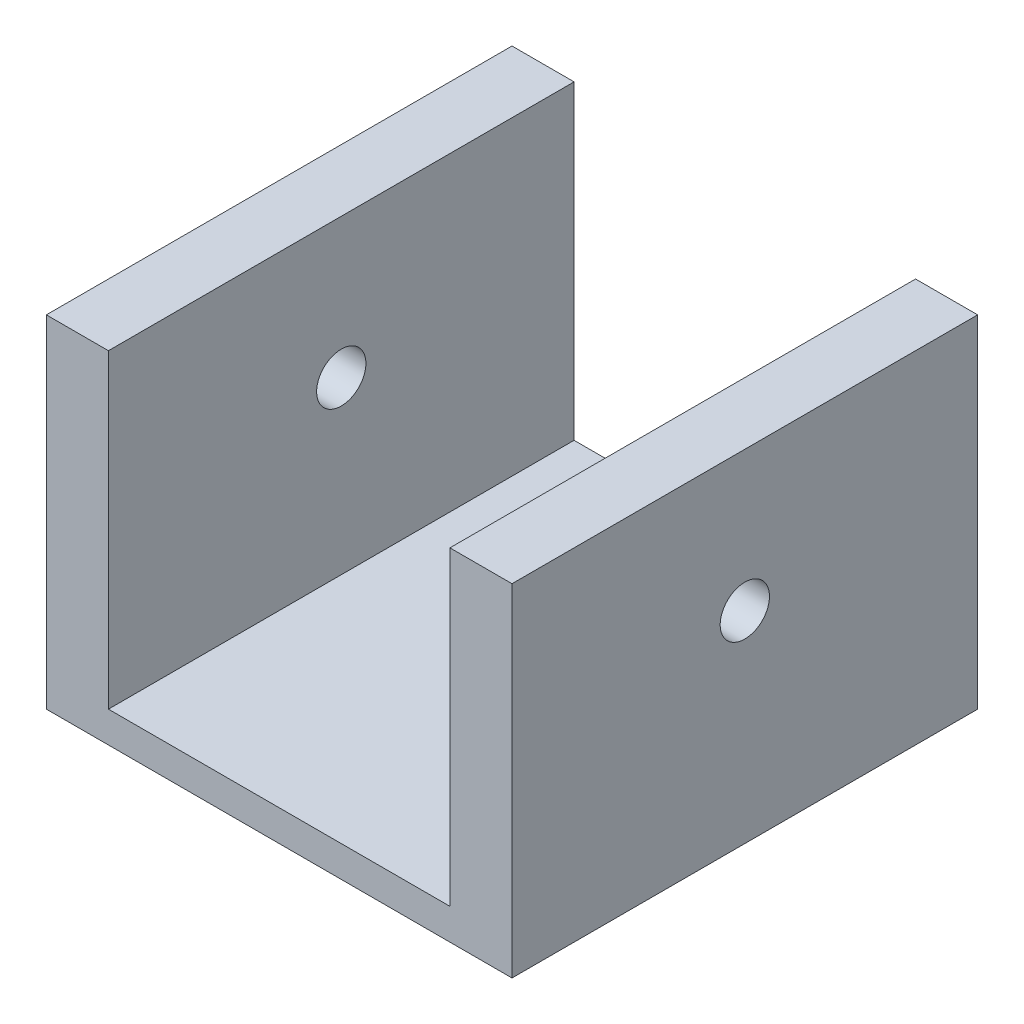
ISO-10303-21;
HEADER;
FILE_DESCRIPTION(('STEP AP214'),'2;1');
FILE_NAME('part.step','',(''),(''),'','','');
FILE_SCHEMA(('AUTOMOTIVE_DESIGN { 1 0 10303 214 1 1 1 1 }'));
ENDSEC;
DATA;
#1=APPLICATION_CONTEXT('core data for automotive mechanical design processes');
#2=APPLICATION_PROTOCOL_DEFINITION('international standard','automotive_design',2000,#1);
#3=PRODUCT_CONTEXT('',#1,'mechanical');
#4=PRODUCT('Part','Part','',(#3));
#5=PRODUCT_RELATED_PRODUCT_CATEGORY('part','',(#4));
#6=PRODUCT_DEFINITION_FORMATION('','',#4);
#7=PRODUCT_DEFINITION_CONTEXT('part definition',#1,'design');
#8=PRODUCT_DEFINITION('design','',#6,#7);
#9=PRODUCT_DEFINITION_SHAPE('','',#8);
#10=(LENGTH_UNIT() NAMED_UNIT(*) SI_UNIT(.MILLI.,.METRE.));
#11=(NAMED_UNIT(*) PLANE_ANGLE_UNIT() SI_UNIT($,.RADIAN.));
#12=(NAMED_UNIT(*) SI_UNIT($,.STERADIAN.) SOLID_ANGLE_UNIT());
#13=UNCERTAINTY_MEASURE_WITH_UNIT(LENGTH_MEASURE(1.E-05),#10,'distance_accuracy_value','');
#14=(GEOMETRIC_REPRESENTATION_CONTEXT(3) GLOBAL_UNCERTAINTY_ASSIGNED_CONTEXT((#13)) GLOBAL_UNIT_ASSIGNED_CONTEXT((#10,
#11,#12)) REPRESENTATION_CONTEXT('',''));
#15=CARTESIAN_POINT('',(0.,0.,0.));
#16=DIRECTION('',(0.,0.,1.));
#17=DIRECTION('',(1.,0.,0.));
#18=AXIS2_PLACEMENT_3D('',#15,#16,#17);
#19=CARTESIAN_POINT('',(0.,10.,0.));
#20=DIRECTION('',(0.,-1.,0.));
#21=DIRECTION('',(0.,0.,-1.));
#22=AXIS2_PLACEMENT_3D('',#19,#20,#21);
#23=PLANE('',#22);
#24=DIRECTION('',(0.,0.,1.));
#25=VECTOR('',#24,1.);
#26=CARTESIAN_POINT('',(55.,10.,75.));
#27=LINE('',#26,#25);
#28=CARTESIAN_POINT('',(55.,10.,-75.));
#29=VERTEX_POINT('',#28);
#30=CARTESIAN_POINT('',(55.,10.,75.));
#31=VERTEX_POINT('',#30);
#32=EDGE_CURVE('E55',#29,#31,#27,.T.);
#33=ORIENTED_EDGE('',*,*,#32,.F.);
#34=DIRECTION('',(-1.,0.,0.));
#35=VECTOR('',#34,1.);
#36=CARTESIAN_POINT('',(-75.,10.,-75.));
#37=LINE('',#36,#35);
#38=CARTESIAN_POINT('',(-55.,10.,-75.));
#39=VERTEX_POINT('',#38);
#40=EDGE_CURVE('E153',#29,#39,#37,.T.);
#41=ORIENTED_EDGE('',*,*,#40,.T.);
#42=DIRECTION('',(0.,0.,-1.));
#43=VECTOR('',#42,1.);
#44=CARTESIAN_POINT('',(-55.,10.,75.));
#45=LINE('',#44,#43);
#46=CARTESIAN_POINT('',(-55.,10.,75.));
#47=VERTEX_POINT('',#46);
#48=EDGE_CURVE('E129',#47,#39,#45,.T.);
#49=ORIENTED_EDGE('',*,*,#48,.F.);
#50=DIRECTION('',(1.,0.,0.));
#51=VECTOR('',#50,1.);
#52=CARTESIAN_POINT('',(-75.,10.,75.));
#53=LINE('',#52,#51);
#54=EDGE_CURVE('E60',#47,#31,#53,.T.);
#55=ORIENTED_EDGE('',*,*,#54,.T.);
#56=EDGE_LOOP('',(#33,#41,#49,#55));
#57=FACE_BOUND('',#56,.T.);
#58=ADVANCED_FACE('F39',(#57),#23,.F.);
#59=CARTESIAN_POINT('',(75.,10.,75.));
#60=DIRECTION('',(-1.,0.,0.));
#61=DIRECTION('',(0.,0.,1.));
#62=AXIS2_PLACEMENT_3D('',#59,#60,#61);
#63=PLANE('',#62);
#64=CARTESIAN_POINT('',(75.,65.,0.));
#65=DIRECTION('',(1.,0.,0.));
#66=DIRECTION('',(0.,0.,-1.));
#67=AXIS2_PLACEMENT_3D('',#64,#65,#66);
#68=CIRCLE('',#67,7.9375);
#69=CARTESIAN_POINT('',(75.,65.,-7.9375));
#70=VERTEX_POINT('',#69);
#71=EDGE_CURVE('E184',#70,#70,#68,.T.);
#72=ORIENTED_EDGE('',*,*,#71,.F.);
#73=EDGE_LOOP('',(#72));
#74=FACE_BOUND('',#73,.T.);
#75=DIRECTION('',(0.,0.,-1.));
#76=VECTOR('',#75,1.);
#77=CARTESIAN_POINT('',(75.,0.,75.));
#78=LINE('',#77,#76);
#79=CARTESIAN_POINT('',(75.,0.,75.));
#80=VERTEX_POINT('',#79);
#81=CARTESIAN_POINT('',(75.,0.,-75.));
#82=VERTEX_POINT('',#81);
#83=EDGE_CURVE('E152',#80,#82,#78,.T.);
#84=ORIENTED_EDGE('',*,*,#83,.T.);
#85=DIRECTION('',(0.,-1.,0.));
#86=VECTOR('',#85,1.);
#87=CARTESIAN_POINT('',(75.,10.,-75.));
#88=LINE('',#87,#86);
#89=CARTESIAN_POINT('',(75.,110.,-75.));
#90=VERTEX_POINT('',#89);
#91=EDGE_CURVE('E11',#90,#82,#88,.T.);
#92=ORIENTED_EDGE('',*,*,#91,.F.);
#93=DIRECTION('',(0.,0.,-1.));
#94=VECTOR('',#93,1.);
#95=CARTESIAN_POINT('',(75.,110.,75.));
#96=LINE('',#95,#94);
#97=CARTESIAN_POINT('',(75.,110.,75.));
#98=VERTEX_POINT('',#97);
#99=EDGE_CURVE('E120',#98,#90,#96,.T.);
#100=ORIENTED_EDGE('',*,*,#99,.F.);
#101=DIRECTION('',(0.,-1.,0.));
#102=VECTOR('',#101,1.);
#103=CARTESIAN_POINT('',(75.,10.,75.));
#104=LINE('',#103,#102);
#105=EDGE_CURVE('E103',#98,#80,#104,.T.);
#106=ORIENTED_EDGE('',*,*,#105,.T.);
#107=EDGE_LOOP('',(#84,#92,#100,#106));
#108=FACE_BOUND('',#107,.T.);
#109=ADVANCED_FACE('F41',(#74,#108),#63,.F.);
#110=CARTESIAN_POINT('',(-75.,10.,-75.));
#111=DIRECTION('',(0.,0.,1.));
#112=DIRECTION('',(1.,0.,0.));
#113=AXIS2_PLACEMENT_3D('',#110,#111,#112);
#114=PLANE('',#113);
#115=DIRECTION('',(-1.,0.,0.));
#116=VECTOR('',#115,1.);
#117=CARTESIAN_POINT('',(-75.,0.,-75.));
#118=LINE('',#117,#116);
#119=CARTESIAN_POINT('',(-75.,0.,-75.));
#120=VERTEX_POINT('',#119);
#121=EDGE_CURVE('E157',#82,#120,#118,.T.);
#122=ORIENTED_EDGE('',*,*,#121,.T.);
#123=DIRECTION('',(0.,-1.,0.));
#124=VECTOR('',#123,1.);
#125=CARTESIAN_POINT('',(-75.,10.,-75.));
#126=LINE('',#125,#124);
#127=CARTESIAN_POINT('',(-75.,110.,-75.));
#128=VERTEX_POINT('',#127);
#129=EDGE_CURVE('E48',#128,#120,#126,.T.);
#130=ORIENTED_EDGE('',*,*,#129,.F.);
#131=DIRECTION('',(-1.,0.,0.));
#132=VECTOR('',#131,1.);
#133=CARTESIAN_POINT('',(-75.,110.,-75.));
#134=LINE('',#133,#132);
#135=CARTESIAN_POINT('',(-55.,110.,-75.));
#136=VERTEX_POINT('',#135);
#137=EDGE_CURVE('E141',#136,#128,#134,.T.);
#138=ORIENTED_EDGE('',*,*,#137,.F.);
#139=DIRECTION('',(0.,-1.,0.));
#140=VECTOR('',#139,1.);
#141=CARTESIAN_POINT('',(-55.,110.,-75.));
#142=LINE('',#141,#140);
#143=EDGE_CURVE('E144',#136,#39,#142,.T.);
#144=ORIENTED_EDGE('',*,*,#143,.T.);
#145=ORIENTED_EDGE('',*,*,#40,.F.);
#146=DIRECTION('',(0.,-1.,0.));
#147=VECTOR('',#146,1.);
#148=CARTESIAN_POINT('',(55.,110.,-75.));
#149=LINE('',#148,#147);
#150=CARTESIAN_POINT('',(55.,110.,-75.));
#151=VERTEX_POINT('',#150);
#152=EDGE_CURVE('E175',#151,#29,#149,.T.);
#153=ORIENTED_EDGE('',*,*,#152,.F.);
#154=DIRECTION('',(-1.,0.,0.));
#155=VECTOR('',#154,1.);
#156=CARTESIAN_POINT('',(75.,110.,-75.));
#157=LINE('',#156,#155);
#158=EDGE_CURVE('E127',#90,#151,#157,.T.);
#159=ORIENTED_EDGE('',*,*,#158,.F.);
#160=ORIENTED_EDGE('',*,*,#91,.T.);
#161=EDGE_LOOP('',(#122,#130,#138,#144,#145,#153,#159,#160));
#162=FACE_BOUND('',#161,.T.);
#163=ADVANCED_FACE('F172',(#162),#114,.F.);
#164=CARTESIAN_POINT('',(-75.,10.,75.));
#165=DIRECTION('',(1.,0.,0.));
#166=DIRECTION('',(0.,0.,-1.));
#167=AXIS2_PLACEMENT_3D('',#164,#165,#166);
#168=PLANE('',#167);
#169=CARTESIAN_POINT('',(-75.,65.,0.));
#170=DIRECTION('',(1.,0.,0.));
#171=DIRECTION('',(0.,0.,-1.));
#172=AXIS2_PLACEMENT_3D('',#169,#170,#171);
#173=CIRCLE('',#172,7.9375);
#174=CARTESIAN_POINT('',(-75.,65.,-7.9375));
#175=VERTEX_POINT('',#174);
#176=EDGE_CURVE('E187',#175,#175,#173,.T.);
#177=ORIENTED_EDGE('',*,*,#176,.T.);
#178=EDGE_LOOP('',(#177));
#179=FACE_BOUND('',#178,.T.);
#180=DIRECTION('',(0.,0.,1.));
#181=VECTOR('',#180,1.);
#182=CARTESIAN_POINT('',(-75.,0.,75.));
#183=LINE('',#182,#181);
#184=CARTESIAN_POINT('',(-75.,0.,75.));
#185=VERTEX_POINT('',#184);
#186=EDGE_CURVE('E159',#120,#185,#183,.T.);
#187=ORIENTED_EDGE('',*,*,#186,.T.);
#188=DIRECTION('',(0.,-1.,0.));
#189=VECTOR('',#188,1.);
#190=CARTESIAN_POINT('',(-75.,10.,75.));
#191=LINE('',#190,#189);
#192=CARTESIAN_POINT('',(-75.,110.,75.));
#193=VERTEX_POINT('',#192);
#194=EDGE_CURVE('E115',#193,#185,#191,.T.);
#195=ORIENTED_EDGE('',*,*,#194,.F.);
#196=DIRECTION('',(0.,0.,1.));
#197=VECTOR('',#196,1.);
#198=CARTESIAN_POINT('',(-75.,110.,75.));
#199=LINE('',#198,#197);
#200=EDGE_CURVE('E134',#128,#193,#199,.T.);
#201=ORIENTED_EDGE('',*,*,#200,.F.);
#202=ORIENTED_EDGE('',*,*,#129,.T.);
#203=EDGE_LOOP('',(#187,#195,#201,#202));
#204=FACE_BOUND('',#203,.T.);
#205=ADVANCED_FACE('F167',(#179,#204),#168,.F.);
#206=CARTESIAN_POINT('',(-75.,10.,75.));
#207=DIRECTION('',(0.,0.,-1.));
#208=DIRECTION('',(-1.,0.,0.));
#209=AXIS2_PLACEMENT_3D('',#206,#207,#208);
#210=PLANE('',#209);
#211=DIRECTION('',(1.,0.,0.));
#212=VECTOR('',#211,1.);
#213=CARTESIAN_POINT('',(-75.,0.,75.));
#214=LINE('',#213,#212);
#215=EDGE_CURVE('E110',#185,#80,#214,.T.);
#216=ORIENTED_EDGE('',*,*,#215,.T.);
#217=ORIENTED_EDGE('',*,*,#105,.F.);
#218=DIRECTION('',(1.,0.,0.));
#219=VECTOR('',#218,1.);
#220=CARTESIAN_POINT('',(75.,110.,75.));
#221=LINE('',#220,#219);
#222=CARTESIAN_POINT('',(55.,110.,75.));
#223=VERTEX_POINT('',#222);
#224=EDGE_CURVE('E107',#223,#98,#221,.T.);
#225=ORIENTED_EDGE('',*,*,#224,.F.);
#226=DIRECTION('',(0.,-1.,0.));
#227=VECTOR('',#226,1.);
#228=CARTESIAN_POINT('',(55.,110.,75.));
#229=LINE('',#228,#227);
#230=EDGE_CURVE('E124',#223,#31,#229,.T.);
#231=ORIENTED_EDGE('',*,*,#230,.T.);
#232=ORIENTED_EDGE('',*,*,#54,.F.);
#233=DIRECTION('',(0.,-1.,0.));
#234=VECTOR('',#233,1.);
#235=CARTESIAN_POINT('',(-55.,110.,75.));
#236=LINE('',#235,#234);
#237=CARTESIAN_POINT('',(-55.,110.,75.));
#238=VERTEX_POINT('',#237);
#239=EDGE_CURVE('E149',#238,#47,#236,.T.);
#240=ORIENTED_EDGE('',*,*,#239,.F.);
#241=DIRECTION('',(1.,0.,0.));
#242=VECTOR('',#241,1.);
#243=CARTESIAN_POINT('',(-75.,110.,75.));
#244=LINE('',#243,#242);
#245=EDGE_CURVE('E137',#193,#238,#244,.T.);
#246=ORIENTED_EDGE('',*,*,#245,.F.);
#247=ORIENTED_EDGE('',*,*,#194,.T.);
#248=EDGE_LOOP('',(#216,#217,#225,#231,#232,#240,#246,#247));
#249=FACE_BOUND('',#248,.T.);
#250=ADVANCED_FACE('F105',(#249),#210,.F.);
#251=CARTESIAN_POINT('',(0.,0.,0.));
#252=DIRECTION('',(0.,-1.,0.));
#253=DIRECTION('',(0.,0.,-1.));
#254=AXIS2_PLACEMENT_3D('',#251,#252,#253);
#255=PLANE('',#254);
#256=ORIENTED_EDGE('',*,*,#83,.F.);
#257=ORIENTED_EDGE('',*,*,#215,.F.);
#258=ORIENTED_EDGE('',*,*,#186,.F.);
#259=ORIENTED_EDGE('',*,*,#121,.F.);
#260=EDGE_LOOP('',(#256,#257,#258,#259));
#261=FACE_BOUND('',#260,.T.);
#262=ADVANCED_FACE('F171',(#261),#255,.T.);
#263=CARTESIAN_POINT('',(-55.,110.,75.));
#264=DIRECTION('',(-1.,0.,0.));
#265=DIRECTION('',(0.,0.,1.));
#266=AXIS2_PLACEMENT_3D('',#263,#264,#265);
#267=PLANE('',#266);
#268=CARTESIAN_POINT('',(-55.,65.,0.));
#269=DIRECTION('',(-1.,0.,0.));
#270=DIRECTION('',(0.,0.,1.));
#271=AXIS2_PLACEMENT_3D('',#268,#269,#270);
#272=CIRCLE('',#271,7.9375);
#273=CARTESIAN_POINT('',(-55.,65.,7.9375));
#274=VERTEX_POINT('',#273);
#275=EDGE_CURVE('E177',#274,#274,#272,.T.);
#276=ORIENTED_EDGE('',*,*,#275,.T.);
#277=EDGE_LOOP('',(#276));
#278=FACE_BOUND('',#277,.T.);
#279=ORIENTED_EDGE('',*,*,#48,.T.);
#280=ORIENTED_EDGE('',*,*,#143,.F.);
#281=DIRECTION('',(0.,0.,-1.));
#282=VECTOR('',#281,1.);
#283=CARTESIAN_POINT('',(-55.,110.,75.));
#284=LINE('',#283,#282);
#285=EDGE_CURVE('E139',#238,#136,#284,.T.);
#286=ORIENTED_EDGE('',*,*,#285,.F.);
#287=ORIENTED_EDGE('',*,*,#239,.T.);
#288=EDGE_LOOP('',(#279,#280,#286,#287));
#289=FACE_BOUND('',#288,.T.);
#290=ADVANCED_FACE('F218',(#278,#289),#267,.F.);
#291=CARTESIAN_POINT('',(0.,110.,0.));
#292=DIRECTION('',(0.,-1.,0.));
#293=DIRECTION('',(0.,0.,-1.));
#294=AXIS2_PLACEMENT_3D('',#291,#292,#293);
#295=PLANE('',#294);
#296=ORIENTED_EDGE('',*,*,#200,.T.);
#297=ORIENTED_EDGE('',*,*,#245,.T.);
#298=ORIENTED_EDGE('',*,*,#285,.T.);
#299=ORIENTED_EDGE('',*,*,#137,.T.);
#300=EDGE_LOOP('',(#296,#297,#298,#299));
#301=FACE_BOUND('',#300,.T.);
#302=ADVANCED_FACE('F237',(#301),#295,.F.);
#303=CARTESIAN_POINT('',(55.,110.,75.));
#304=DIRECTION('',(1.,0.,0.));
#305=DIRECTION('',(0.,0.,-1.));
#306=AXIS2_PLACEMENT_3D('',#303,#304,#305);
#307=PLANE('',#306);
#308=CARTESIAN_POINT('',(55.,65.,0.));
#309=DIRECTION('',(1.,0.,0.));
#310=DIRECTION('',(0.,0.,-1.));
#311=AXIS2_PLACEMENT_3D('',#308,#309,#310);
#312=CIRCLE('',#311,7.9375);
#313=CARTESIAN_POINT('',(55.,65.,-7.9375));
#314=VERTEX_POINT('',#313);
#315=EDGE_CURVE('E43',#314,#314,#312,.T.);
#316=ORIENTED_EDGE('',*,*,#315,.T.);
#317=EDGE_LOOP('',(#316));
#318=FACE_BOUND('',#317,.T.);
#319=ORIENTED_EDGE('',*,*,#32,.T.);
#320=ORIENTED_EDGE('',*,*,#230,.F.);
#321=DIRECTION('',(0.,0.,1.));
#322=VECTOR('',#321,1.);
#323=CARTESIAN_POINT('',(55.,110.,75.));
#324=LINE('',#323,#322);
#325=EDGE_CURVE('E122',#151,#223,#324,.T.);
#326=ORIENTED_EDGE('',*,*,#325,.F.);
#327=ORIENTED_EDGE('',*,*,#152,.T.);
#328=EDGE_LOOP('',(#319,#320,#326,#327));
#329=FACE_BOUND('',#328,.T.);
#330=ADVANCED_FACE('F179',(#318,#329),#307,.F.);
#331=CARTESIAN_POINT('',(0.,110.,0.));
#332=DIRECTION('',(0.,1.,0.));
#333=DIRECTION('',(0.,0.,1.));
#334=AXIS2_PLACEMENT_3D('',#331,#332,#333);
#335=PLANE('',#334);
#336=ORIENTED_EDGE('',*,*,#99,.T.);
#337=ORIENTED_EDGE('',*,*,#158,.T.);
#338=ORIENTED_EDGE('',*,*,#325,.T.);
#339=ORIENTED_EDGE('',*,*,#224,.T.);
#340=EDGE_LOOP('',(#336,#337,#338,#339));
#341=FACE_BOUND('',#340,.T.);
#342=ADVANCED_FACE('F119',(#341),#335,.T.);
#343=CARTESIAN_POINT('',(-75.,65.,0.));
#344=DIRECTION('',(1.,0.,0.));
#345=DIRECTION('',(0.,0.,-1.));
#346=AXIS2_PLACEMENT_3D('',#343,#344,#345);
#347=CYLINDRICAL_SURFACE('',#346,7.9375);
#348=ORIENTED_EDGE('',*,*,#71,.T.);
#349=EDGE_LOOP('',(#348));
#350=FACE_BOUND('',#349,.T.);
#351=ORIENTED_EDGE('',*,*,#315,.F.);
#352=EDGE_LOOP('',(#351));
#353=FACE_BOUND('',#352,.T.);
#354=ADVANCED_FACE('F195',(#350,#353),#347,.F.);
#355=ORIENTED_EDGE('',*,*,#176,.F.);
#356=EDGE_LOOP('',(#355));
#357=FACE_BOUND('',#356,.T.);
#358=ORIENTED_EDGE('',*,*,#275,.F.);
#359=EDGE_LOOP('',(#358));
#360=FACE_BOUND('',#359,.T.);
#361=ADVANCED_FACE('F197',(#357,#360),#347,.F.);
#362=CLOSED_SHELL('',(#58,#109,#163,#205,#250,#262,#290,#302,#330,#342,#354,#361));
#363=MANIFOLD_SOLID_BREP('B2',#362);
#364=ADVANCED_BREP_SHAPE_REPRESENTATION('',(#18,#363),#14);
#365=SHAPE_DEFINITION_REPRESENTATION(#9,#364);
ENDSEC;
END-ISO-10303-21;
